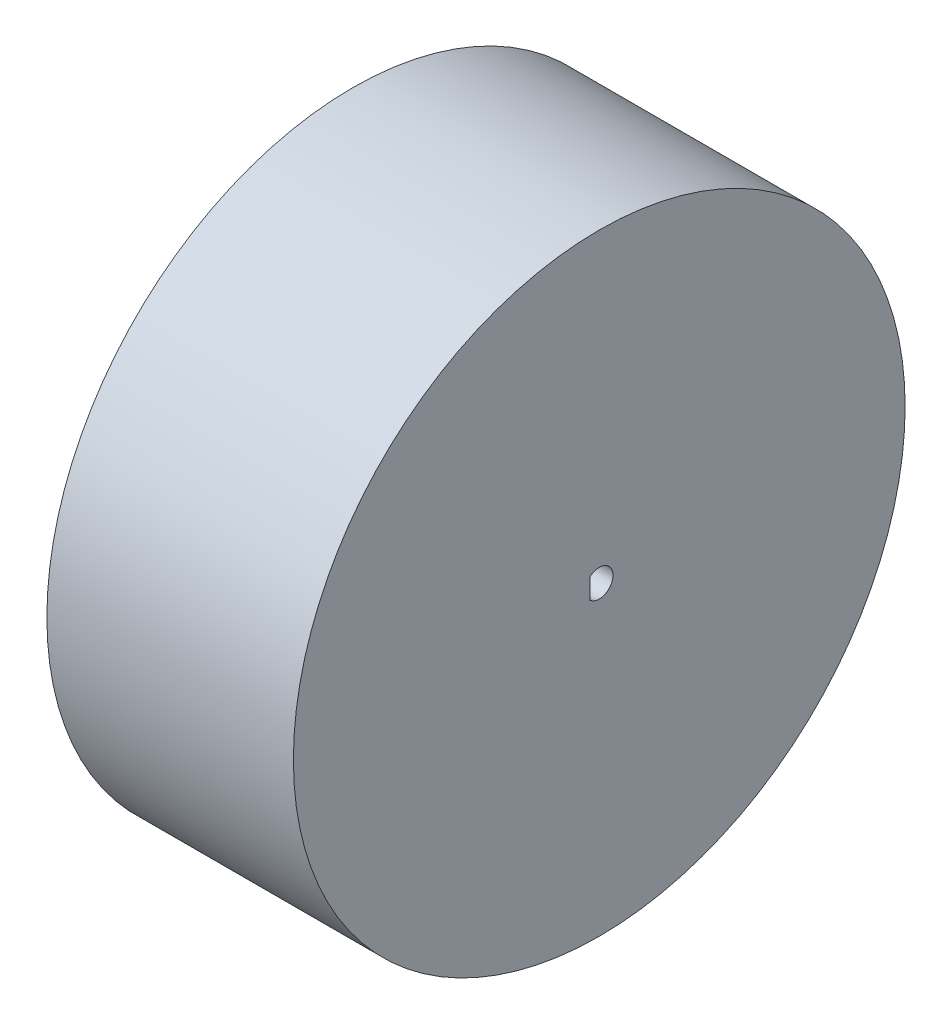
ISO-10303-21;
HEADER;
FILE_DESCRIPTION(('STEP AP214'),'2;1');
FILE_NAME('part.step','',(''),(''),'','','');
FILE_SCHEMA(('AUTOMOTIVE_DESIGN { 1 0 10303 214 1 1 1 1 }'));
ENDSEC;
DATA;
#1=APPLICATION_CONTEXT('core data for automotive mechanical design processes');
#2=APPLICATION_PROTOCOL_DEFINITION('international standard','automotive_design',2000,#1);
#3=PRODUCT_CONTEXT('',#1,'mechanical');
#4=PRODUCT('Part','Part','',(#3));
#5=PRODUCT_RELATED_PRODUCT_CATEGORY('part','',(#4));
#6=PRODUCT_DEFINITION_FORMATION('','',#4);
#7=PRODUCT_DEFINITION_CONTEXT('part definition',#1,'design');
#8=PRODUCT_DEFINITION('design','',#6,#7);
#9=PRODUCT_DEFINITION_SHAPE('','',#8);
#10=(LENGTH_UNIT() NAMED_UNIT(*) SI_UNIT(.MILLI.,.METRE.));
#11=(NAMED_UNIT(*) PLANE_ANGLE_UNIT() SI_UNIT($,.RADIAN.));
#12=(NAMED_UNIT(*) SI_UNIT($,.STERADIAN.) SOLID_ANGLE_UNIT());
#13=UNCERTAINTY_MEASURE_WITH_UNIT(LENGTH_MEASURE(1.E-05),#10,'distance_accuracy_value','');
#14=(GEOMETRIC_REPRESENTATION_CONTEXT(3) GLOBAL_UNCERTAINTY_ASSIGNED_CONTEXT((#13)) GLOBAL_UNIT_ASSIGNED_CONTEXT((#10,
#11,#12)) REPRESENTATION_CONTEXT('',''));
#15=CARTESIAN_POINT('',(0.,0.,0.));
#16=DIRECTION('',(0.,0.,1.));
#17=DIRECTION('',(1.,0.,0.));
#18=AXIS2_PLACEMENT_3D('',#15,#16,#17);
#19=CARTESIAN_POINT('',(27.,0.,0.));
#20=DIRECTION('',(1.,0.,0.));
#21=DIRECTION('',(0.,0.,-1.));
#22=AXIS2_PLACEMENT_3D('',#19,#20,#21);
#23=PLANE('',#22);
#24=CARTESIAN_POINT('',(27.,0.,0.));
#25=DIRECTION('',(1.,0.,0.));
#26=DIRECTION('',(0.,0.,-1.));
#27=AXIS2_PLACEMENT_3D('',#24,#25,#26);
#28=CIRCLE('',#27,33.5);
#29=CARTESIAN_POINT('',(27.,0.,-33.5));
#30=VERTEX_POINT('',#29);
#31=EDGE_CURVE('E11',#30,#30,#28,.T.);
#32=ORIENTED_EDGE('',*,*,#31,.T.);
#33=EDGE_LOOP('',(#32));
#34=FACE_BOUND('',#33,.T.);
#35=DIRECTION('',(0.,-1.,0.));
#36=VECTOR('',#35,1.);
#37=CARTESIAN_POINT('',(27.,1.1180339887499,1.));
#38=LINE('',#37,#36);
#39=CARTESIAN_POINT('',(27.,1.1180339887499,1.));
#40=VERTEX_POINT('',#39);
#41=CARTESIAN_POINT('',(27.,-1.1180339887499,1.));
#42=VERTEX_POINT('',#41);
#43=EDGE_CURVE('E74',#40,#42,#38,.T.);
#44=ORIENTED_EDGE('',*,*,#43,.F.);
#45=CARTESIAN_POINT('',(27.,0.,0.));
#46=DIRECTION('',(1.,0.,0.));
#47=DIRECTION('',(0.,0.,-1.));
#48=AXIS2_PLACEMENT_3D('',#45,#46,#47);
#49=CIRCLE('',#48,1.5);
#50=EDGE_CURVE('E65',#42,#40,#49,.T.);
#51=ORIENTED_EDGE('',*,*,#50,.F.);
#52=EDGE_LOOP('',(#44,#51));
#53=FACE_BOUND('',#52,.T.);
#54=ADVANCED_FACE('F33',(#34,#53),#23,.T.);
#55=CARTESIAN_POINT('',(0.,0.,0.));
#56=DIRECTION('',(1.,0.,0.));
#57=DIRECTION('',(0.,0.,-1.));
#58=AXIS2_PLACEMENT_3D('',#55,#56,#57);
#59=PLANE('',#58);
#60=CARTESIAN_POINT('',(0.,0.,0.));
#61=DIRECTION('',(1.,0.,0.));
#62=DIRECTION('',(0.,0.,-1.));
#63=AXIS2_PLACEMENT_3D('',#60,#61,#62);
#64=CIRCLE('',#63,33.5);
#65=CARTESIAN_POINT('',(0.,0.,-33.5));
#66=VERTEX_POINT('',#65);
#67=EDGE_CURVE('E37',#66,#66,#64,.T.);
#68=ORIENTED_EDGE('',*,*,#67,.F.);
#69=EDGE_LOOP('',(#68));
#70=FACE_BOUND('',#69,.T.);
#71=CARTESIAN_POINT('',(0.,0.,0.));
#72=DIRECTION('',(1.,0.,0.));
#73=DIRECTION('',(0.,0.,-1.));
#74=AXIS2_PLACEMENT_3D('',#71,#72,#73);
#75=CIRCLE('',#74,1.5);
#76=CARTESIAN_POINT('',(0.,-1.1180339887499,1.));
#77=VERTEX_POINT('',#76);
#78=CARTESIAN_POINT('',(0.,1.1180339887499,1.));
#79=VERTEX_POINT('',#78);
#80=EDGE_CURVE('E55',#77,#79,#75,.T.);
#81=ORIENTED_EDGE('',*,*,#80,.T.);
#82=DIRECTION('',(0.,-1.,0.));
#83=VECTOR('',#82,1.);
#84=CARTESIAN_POINT('',(0.,1.1180339887499,1.));
#85=LINE('',#84,#83);
#86=EDGE_CURVE('E61',#79,#77,#85,.T.);
#87=ORIENTED_EDGE('',*,*,#86,.T.);
#88=EDGE_LOOP('',(#81,#87));
#89=FACE_BOUND('',#88,.T.);
#90=ADVANCED_FACE('F71',(#70,#89),#59,.F.);
#91=CARTESIAN_POINT('',(27.,0.,0.));
#92=DIRECTION('',(-1.,0.,0.));
#93=DIRECTION('',(0.,0.,1.));
#94=AXIS2_PLACEMENT_3D('',#91,#92,#93);
#95=CYLINDRICAL_SURFACE('',#94,33.5);
#96=ORIENTED_EDGE('',*,*,#31,.F.);
#97=EDGE_LOOP('',(#96));
#98=FACE_BOUND('',#97,.T.);
#99=ORIENTED_EDGE('',*,*,#67,.T.);
#100=EDGE_LOOP('',(#99));
#101=FACE_BOUND('',#100,.T.);
#102=ADVANCED_FACE('F35',(#98,#101),#95,.T.);
#103=CARTESIAN_POINT('',(27.,0.,0.));
#104=DIRECTION('',(-1.,0.,0.));
#105=DIRECTION('',(0.,0.,1.));
#106=AXIS2_PLACEMENT_3D('',#103,#104,#105);
#107=CYLINDRICAL_SURFACE('',#106,1.5);
#108=ORIENTED_EDGE('',*,*,#80,.F.);
#109=DIRECTION('',(-1.,0.,0.));
#110=VECTOR('',#109,1.);
#111=CARTESIAN_POINT('',(27.,-1.1180339887499,1.));
#112=LINE('',#111,#110);
#113=EDGE_CURVE('E63',#42,#77,#112,.T.);
#114=ORIENTED_EDGE('',*,*,#113,.F.);
#115=ORIENTED_EDGE('',*,*,#50,.T.);
#116=DIRECTION('',(-1.,0.,0.));
#117=VECTOR('',#116,1.);
#118=CARTESIAN_POINT('',(27.,1.1180339887499,1.));
#119=LINE('',#118,#117);
#120=EDGE_CURVE('E48',#40,#79,#119,.T.);
#121=ORIENTED_EDGE('',*,*,#120,.T.);
#122=EDGE_LOOP('',(#108,#114,#115,#121));
#123=FACE_BOUND('',#122,.T.);
#124=ADVANCED_FACE('F67',(#123),#107,.F.);
#125=CARTESIAN_POINT('',(27.,1.1180339887499,1.));
#126=DIRECTION('',(0.,0.,-1.));
#127=DIRECTION('',(-1.,0.,0.));
#128=AXIS2_PLACEMENT_3D('',#125,#126,#127);
#129=PLANE('',#128);
#130=ORIENTED_EDGE('',*,*,#86,.F.);
#131=ORIENTED_EDGE('',*,*,#120,.F.);
#132=ORIENTED_EDGE('',*,*,#43,.T.);
#133=ORIENTED_EDGE('',*,*,#113,.T.);
#134=EDGE_LOOP('',(#130,#131,#132,#133));
#135=FACE_BOUND('',#134,.T.);
#136=ADVANCED_FACE('F62',(#135),#129,.T.);
#137=CLOSED_SHELL('',(#54,#90,#102,#124,#136));
#138=MANIFOLD_SOLID_BREP('B2',#137);
#139=ADVANCED_BREP_SHAPE_REPRESENTATION('',(#18,#138),#14);
#140=SHAPE_DEFINITION_REPRESENTATION(#9,#139);
ENDSEC;
END-ISO-10303-21;
